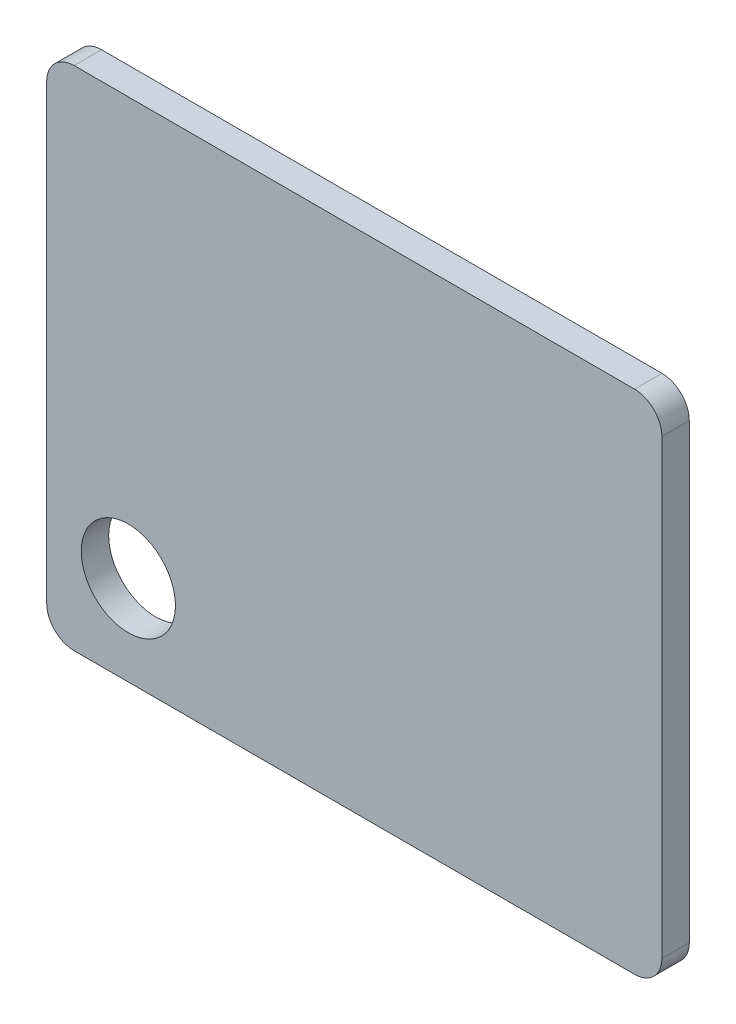
ISO-10303-21;
HEADER;
FILE_DESCRIPTION(('STEP AP214'),'2;1');
FILE_NAME('part.step','',(''),(''),'','','');
FILE_SCHEMA(('AUTOMOTIVE_DESIGN { 1 0 10303 214 1 1 1 1 }'));
ENDSEC;
DATA;
#1=APPLICATION_CONTEXT('core data for automotive mechanical design processes');
#2=APPLICATION_PROTOCOL_DEFINITION('international standard','automotive_design',2000,#1);
#3=PRODUCT_CONTEXT('',#1,'mechanical');
#4=PRODUCT('Part','Part','',(#3));
#5=PRODUCT_RELATED_PRODUCT_CATEGORY('part','',(#4));
#6=PRODUCT_DEFINITION_FORMATION('','',#4);
#7=PRODUCT_DEFINITION_CONTEXT('part definition',#1,'design');
#8=PRODUCT_DEFINITION('design','',#6,#7);
#9=PRODUCT_DEFINITION_SHAPE('','',#8);
#10=(LENGTH_UNIT() NAMED_UNIT(*) SI_UNIT(.MILLI.,.METRE.));
#11=(NAMED_UNIT(*) PLANE_ANGLE_UNIT() SI_UNIT($,.RADIAN.));
#12=(NAMED_UNIT(*) SI_UNIT($,.STERADIAN.) SOLID_ANGLE_UNIT());
#13=UNCERTAINTY_MEASURE_WITH_UNIT(LENGTH_MEASURE(1.E-05),#10,'distance_accuracy_value','');
#14=(GEOMETRIC_REPRESENTATION_CONTEXT(3) GLOBAL_UNCERTAINTY_ASSIGNED_CONTEXT((#13)) GLOBAL_UNIT_ASSIGNED_CONTEXT((#10,
#11,#12)) REPRESENTATION_CONTEXT('',''));
#15=CARTESIAN_POINT('',(0.,0.,0.));
#16=DIRECTION('',(0.,0.,1.));
#17=DIRECTION('',(1.,0.,0.));
#18=AXIS2_PLACEMENT_3D('',#15,#16,#17);
#19=CARTESIAN_POINT('',(-0.656919797954,-0.592175564513,0.79));
#20=DIRECTION('',(0.,0.,1.));
#21=DIRECTION('',(1.,0.,0.));
#22=AXIS2_PLACEMENT_3D('',#19,#20,#21);
#23=PLANE('',#22);
#24=CARTESIAN_POINT('',(-0.828774343426,-0.592175564513,0.79));
#25=DIRECTION('',(0.,0.,-1.));
#26=DIRECTION('',(-1.,0.,0.));
#27=AXIS2_PLACEMENT_3D('',#24,#25,#26);
#28=CIRCLE('',#27,0.171854545472);
#29=CARTESIAN_POINT('',(-1.000628888898,-0.592175564513,0.79));
#30=VERTEX_POINT('',#29);
#31=EDGE_CURVE('E128',#30,#30,#28,.T.);
#32=ORIENTED_EDGE('',*,*,#31,.T.);
#33=EDGE_LOOP('',(#32));
#34=FACE_BOUND('',#33,.T.);
#35=DIRECTION('',(0.,1.,0.));
#36=VECTOR('',#35,1.);
#37=CARTESIAN_POINT('',(1.118498384139,0.004988071731455,0.79));
#38=LINE('',#37,#36);
#39=CARTESIAN_POINT('',(1.118498384139,0.829788071824,0.79));
#40=VERTEX_POINT('',#39);
#41=CARTESIAN_POINT('',(1.118498384139,-0.819811928361,0.79));
#42=VERTEX_POINT('',#41);
#43=EDGE_CURVE('E92',#40,#42,#38,.F.);
#44=ORIENTED_EDGE('',*,*,#43,.F.);
#45=CARTESIAN_POINT('',(1.018498384139,0.829788071824,0.79));
#46=DIRECTION('',(0.,0.,-1.));
#47=DIRECTION('',(-1.,0.,0.));
#48=AXIS2_PLACEMENT_3D('',#45,#46,#47);
#49=CIRCLE('',#48,0.1);
#50=CARTESIAN_POINT('',(1.018498384139,0.929788071824,0.79));
#51=VERTEX_POINT('',#50);
#52=EDGE_CURVE('E20',#51,#40,#49,.T.);
#53=ORIENTED_EDGE('',*,*,#52,.F.);
#54=DIRECTION('',(-1.,0.,0.));
#55=VECTOR('',#54,1.);
#56=CARTESIAN_POINT('',(-0.004119797791775,0.929788071824,0.79));
#57=LINE('',#56,#55);
#58=CARTESIAN_POINT('',(-1.026737979722,0.929788071824,0.79));
#59=VERTEX_POINT('',#58);
#60=EDGE_CURVE('E79',#59,#51,#57,.F.);
#61=ORIENTED_EDGE('',*,*,#60,.F.);
#62=CARTESIAN_POINT('',(-1.026737979722,0.829788071824,0.79));
#63=DIRECTION('',(0.,0.,-1.));
#64=DIRECTION('',(-1.,0.,0.));
#65=AXIS2_PLACEMENT_3D('',#62,#63,#64);
#66=CIRCLE('',#65,0.1);
#67=CARTESIAN_POINT('',(-1.126737979722,0.829788071824,0.79));
#68=VERTEX_POINT('',#67);
#69=EDGE_CURVE('E134',#68,#59,#66,.T.);
#70=ORIENTED_EDGE('',*,*,#69,.F.);
#71=DIRECTION('',(0.,1.,0.));
#72=VECTOR('',#71,1.);
#73=CARTESIAN_POINT('',(-1.126737979722,0.004988071731455,0.79));
#74=LINE('',#73,#72);
#75=CARTESIAN_POINT('',(-1.126737979722,-0.819811928361,0.79));
#76=VERTEX_POINT('',#75);
#77=EDGE_CURVE('E112',#76,#68,#74,.T.);
#78=ORIENTED_EDGE('',*,*,#77,.F.);
#79=CARTESIAN_POINT('',(-1.026737979722,-0.819811928361,0.79));
#80=DIRECTION('',(0.,0.,-1.));
#81=DIRECTION('',(-1.,0.,0.));
#82=AXIS2_PLACEMENT_3D('',#79,#80,#81);
#83=CIRCLE('',#82,0.1);
#84=CARTESIAN_POINT('',(-1.026737979722,-0.919811928361,0.79));
#85=VERTEX_POINT('',#84);
#86=EDGE_CURVE('E133',#85,#76,#83,.T.);
#87=ORIENTED_EDGE('',*,*,#86,.F.);
#88=DIRECTION('',(1.,0.,0.));
#89=VECTOR('',#88,1.);
#90=CARTESIAN_POINT('',(-0.004119797791775,-0.919811928361,0.79));
#91=LINE('',#90,#89);
#92=CARTESIAN_POINT('',(1.018498384139,-0.919811928361,0.79));
#93=VERTEX_POINT('',#92);
#94=EDGE_CURVE('E108',#93,#85,#91,.F.);
#95=ORIENTED_EDGE('',*,*,#94,.F.);
#96=CARTESIAN_POINT('',(1.018498384139,-0.819811928361,0.79));
#97=DIRECTION('',(0.,0.,-1.));
#98=DIRECTION('',(-1.,0.,0.));
#99=AXIS2_PLACEMENT_3D('',#96,#97,#98);
#100=CIRCLE('',#99,0.1);
#101=EDGE_CURVE('E95',#42,#93,#100,.T.);
#102=ORIENTED_EDGE('',*,*,#101,.F.);
#103=EDGE_LOOP('',(#44,#53,#61,#70,#78,#87,#95,#102));
#104=FACE_BOUND('',#103,.T.);
#105=ADVANCED_FACE('F17',(#34,#104),#23,.T.);
#106=CARTESIAN_POINT('',(1.118498384139,0.004988071731455,0.69));
#107=DIRECTION('',(1.,0.,0.));
#108=DIRECTION('',(0.,0.,-1.));
#109=AXIS2_PLACEMENT_3D('',#106,#107,#108);
#110=PLANE('',#109);
#111=ORIENTED_EDGE('',*,*,#43,.T.);
#112=DIRECTION('',(0.,0.,-1.));
#113=VECTOR('',#112,1.);
#114=CARTESIAN_POINT('',(1.118498384139,-0.819811928361,0.69));
#115=LINE('',#114,#113);
#116=CARTESIAN_POINT('',(1.118498384139,-0.819811928361,0.69));
#117=VERTEX_POINT('',#116);
#118=EDGE_CURVE('E132',#117,#42,#115,.F.);
#119=ORIENTED_EDGE('',*,*,#118,.F.);
#120=DIRECTION('',(0.,1.,0.));
#121=VECTOR('',#120,1.);
#122=CARTESIAN_POINT('',(1.118498384139,0.004988071731455,0.69));
#123=LINE('',#122,#121);
#124=CARTESIAN_POINT('',(1.118498384139,0.829788071824,0.69));
#125=VERTEX_POINT('',#124);
#126=EDGE_CURVE('E102',#117,#125,#123,.T.);
#127=ORIENTED_EDGE('',*,*,#126,.T.);
#128=DIRECTION('',(0.,0.,-1.));
#129=VECTOR('',#128,1.);
#130=CARTESIAN_POINT('',(1.118498384139,0.829788071824,0.69));
#131=LINE('',#130,#129);
#132=EDGE_CURVE('E88',#40,#125,#131,.T.);
#133=ORIENTED_EDGE('',*,*,#132,.F.);
#134=EDGE_LOOP('',(#111,#119,#127,#133));
#135=FACE_BOUND('',#134,.T.);
#136=ADVANCED_FACE('F101',(#135),#110,.T.);
#137=CARTESIAN_POINT('',(1.018498384139,0.829788071824,0.69));
#138=DIRECTION('',(0.,0.,-1.));
#139=DIRECTION('',(-1.,0.,0.));
#140=AXIS2_PLACEMENT_3D('',#137,#138,#139);
#141=CYLINDRICAL_SURFACE('',#140,0.1);
#142=ORIENTED_EDGE('',*,*,#132,.T.);
#143=CARTESIAN_POINT('',(1.018498384139,0.829788071824,0.69));
#144=DIRECTION('',(0.,0.,-1.));
#145=DIRECTION('',(-1.,0.,0.));
#146=AXIS2_PLACEMENT_3D('',#143,#144,#145);
#147=CIRCLE('',#146,0.1);
#148=CARTESIAN_POINT('',(1.018498384139,0.929788071824,0.69));
#149=VERTEX_POINT('',#148);
#150=EDGE_CURVE('E126',#125,#149,#147,.F.);
#151=ORIENTED_EDGE('',*,*,#150,.T.);
#152=DIRECTION('',(0.,0.,1.));
#153=VECTOR('',#152,1.);
#154=CARTESIAN_POINT('',(1.018498384139,0.929788071824,0.69));
#155=LINE('',#154,#153);
#156=EDGE_CURVE('E90',#51,#149,#155,.F.);
#157=ORIENTED_EDGE('',*,*,#156,.F.);
#158=ORIENTED_EDGE('',*,*,#52,.T.);
#159=EDGE_LOOP('',(#142,#151,#157,#158));
#160=FACE_BOUND('',#159,.T.);
#161=ADVANCED_FACE('F85',(#160),#141,.T.);
#162=CARTESIAN_POINT('',(-0.004119797791775,0.929788071824,0.69));
#163=DIRECTION('',(0.,1.,0.));
#164=DIRECTION('',(-1.,0.,0.));
#165=AXIS2_PLACEMENT_3D('',#162,#163,#164);
#166=PLANE('',#165);
#167=ORIENTED_EDGE('',*,*,#60,.T.);
#168=ORIENTED_EDGE('',*,*,#156,.T.);
#169=DIRECTION('',(1.,0.,0.));
#170=VECTOR('',#169,1.);
#171=CARTESIAN_POINT('',(-0.004119797791775,0.929788071824,0.69));
#172=LINE('',#171,#170);
#173=CARTESIAN_POINT('',(-1.026737979722,0.929788071824,0.69));
#174=VERTEX_POINT('',#173);
#175=EDGE_CURVE('E125',#149,#174,#172,.F.);
#176=ORIENTED_EDGE('',*,*,#175,.T.);
#177=DIRECTION('',(0.,0.,-1.));
#178=VECTOR('',#177,1.);
#179=CARTESIAN_POINT('',(-1.026737979722,0.929788071824,0.69));
#180=LINE('',#179,#178);
#181=EDGE_CURVE('E114',#59,#174,#180,.T.);
#182=ORIENTED_EDGE('',*,*,#181,.F.);
#183=EDGE_LOOP('',(#167,#168,#176,#182));
#184=FACE_BOUND('',#183,.T.);
#185=ADVANCED_FACE('F140',(#184),#166,.T.);
#186=CARTESIAN_POINT('',(-1.026737979722,0.829788071824,0.69));
#187=DIRECTION('',(0.,0.,-1.));
#188=DIRECTION('',(-1.,0.,0.));
#189=AXIS2_PLACEMENT_3D('',#186,#187,#188);
#190=CYLINDRICAL_SURFACE('',#189,0.1);
#191=ORIENTED_EDGE('',*,*,#181,.T.);
#192=CARTESIAN_POINT('',(-1.026737979722,0.829788071824,0.69));
#193=DIRECTION('',(0.,0.,-1.));
#194=DIRECTION('',(-1.,0.,0.));
#195=AXIS2_PLACEMENT_3D('',#192,#193,#194);
#196=CIRCLE('',#195,0.1);
#197=CARTESIAN_POINT('',(-1.126737979722,0.829788071824,0.69));
#198=VERTEX_POINT('',#197);
#199=EDGE_CURVE('E122',#174,#198,#196,.F.);
#200=ORIENTED_EDGE('',*,*,#199,.T.);
#201=DIRECTION('',(0.,0.,1.));
#202=VECTOR('',#201,1.);
#203=CARTESIAN_POINT('',(-1.126737979722,0.829788071824,0.69));
#204=LINE('',#203,#202);
#205=EDGE_CURVE('E113',#68,#198,#204,.F.);
#206=ORIENTED_EDGE('',*,*,#205,.F.);
#207=ORIENTED_EDGE('',*,*,#69,.T.);
#208=EDGE_LOOP('',(#191,#200,#206,#207));
#209=FACE_BOUND('',#208,.T.);
#210=ADVANCED_FACE('F161',(#209),#190,.T.);
#211=CARTESIAN_POINT('',(-1.126737979722,0.004988071731455,0.69));
#212=DIRECTION('',(-1.,0.,0.));
#213=DIRECTION('',(0.,0.,1.));
#214=AXIS2_PLACEMENT_3D('',#211,#212,#213);
#215=PLANE('',#214);
#216=ORIENTED_EDGE('',*,*,#77,.T.);
#217=ORIENTED_EDGE('',*,*,#205,.T.);
#218=DIRECTION('',(0.,1.,0.));
#219=VECTOR('',#218,1.);
#220=CARTESIAN_POINT('',(-1.126737979722,0.004988071731455,0.69));
#221=LINE('',#220,#219);
#222=CARTESIAN_POINT('',(-1.126737979722,-0.819811928361,0.69));
#223=VERTEX_POINT('',#222);
#224=EDGE_CURVE('E121',#198,#223,#221,.F.);
#225=ORIENTED_EDGE('',*,*,#224,.T.);
#226=DIRECTION('',(0.,0.,-1.));
#227=VECTOR('',#226,1.);
#228=CARTESIAN_POINT('',(-1.126737979722,-0.819811928361,0.69));
#229=LINE('',#228,#227);
#230=EDGE_CURVE('E110',#76,#223,#229,.T.);
#231=ORIENTED_EDGE('',*,*,#230,.F.);
#232=EDGE_LOOP('',(#216,#217,#225,#231));
#233=FACE_BOUND('',#232,.T.);
#234=ADVANCED_FACE('F157',(#233),#215,.T.);
#235=CARTESIAN_POINT('',(-1.026737979722,-0.819811928361,0.69));
#236=DIRECTION('',(0.,0.,-1.));
#237=DIRECTION('',(-1.,0.,0.));
#238=AXIS2_PLACEMENT_3D('',#235,#236,#237);
#239=CYLINDRICAL_SURFACE('',#238,0.1);
#240=ORIENTED_EDGE('',*,*,#230,.T.);
#241=CARTESIAN_POINT('',(-1.026737979722,-0.819811928361,0.69));
#242=DIRECTION('',(0.,0.,-1.));
#243=DIRECTION('',(-1.,0.,0.));
#244=AXIS2_PLACEMENT_3D('',#241,#242,#243);
#245=CIRCLE('',#244,0.1);
#246=CARTESIAN_POINT('',(-1.026737979722,-0.919811928361,0.69));
#247=VERTEX_POINT('',#246);
#248=EDGE_CURVE('E118',#223,#247,#245,.F.);
#249=ORIENTED_EDGE('',*,*,#248,.T.);
#250=DIRECTION('',(0.,0.,-1.));
#251=VECTOR('',#250,1.);
#252=CARTESIAN_POINT('',(-1.026737979722,-0.919811928361,0.69));
#253=LINE('',#252,#251);
#254=EDGE_CURVE('E109',#85,#247,#253,.T.);
#255=ORIENTED_EDGE('',*,*,#254,.F.);
#256=ORIENTED_EDGE('',*,*,#86,.T.);
#257=EDGE_LOOP('',(#240,#249,#255,#256));
#258=FACE_BOUND('',#257,.T.);
#259=ADVANCED_FACE('F169',(#258),#239,.T.);
#260=CARTESIAN_POINT('',(-0.004119797791775,-0.919811928361,0.69));
#261=DIRECTION('',(0.,-1.,0.));
#262=DIRECTION('',(0.,0.,-1.));
#263=AXIS2_PLACEMENT_3D('',#260,#261,#262);
#264=PLANE('',#263);
#265=ORIENTED_EDGE('',*,*,#94,.T.);
#266=ORIENTED_EDGE('',*,*,#254,.T.);
#267=DIRECTION('',(1.,0.,0.));
#268=VECTOR('',#267,1.);
#269=CARTESIAN_POINT('',(-0.004119797791775,-0.919811928361,0.69));
#270=LINE('',#269,#268);
#271=CARTESIAN_POINT('',(1.018498384139,-0.919811928361,0.69));
#272=VERTEX_POINT('',#271);
#273=EDGE_CURVE('E117',#247,#272,#270,.T.);
#274=ORIENTED_EDGE('',*,*,#273,.T.);
#275=DIRECTION('',(0.,0.,-1.));
#276=VECTOR('',#275,1.);
#277=CARTESIAN_POINT('',(1.018498384139,-0.919811928361,0.69));
#278=LINE('',#277,#276);
#279=EDGE_CURVE('E35',#93,#272,#278,.T.);
#280=ORIENTED_EDGE('',*,*,#279,.F.);
#281=EDGE_LOOP('',(#265,#266,#274,#280));
#282=FACE_BOUND('',#281,.T.);
#283=ADVANCED_FACE('F186',(#282),#264,.T.);
#284=CARTESIAN_POINT('',(1.018498384139,-0.819811928361,0.69));
#285=DIRECTION('',(0.,0.,-1.));
#286=DIRECTION('',(-1.,0.,0.));
#287=AXIS2_PLACEMENT_3D('',#284,#285,#286);
#288=CYLINDRICAL_SURFACE('',#287,0.1);
#289=ORIENTED_EDGE('',*,*,#279,.T.);
#290=CARTESIAN_POINT('',(1.018498384139,-0.819811928361,0.69));
#291=DIRECTION('',(0.,0.,-1.));
#292=DIRECTION('',(-1.,0.,0.));
#293=AXIS2_PLACEMENT_3D('',#290,#291,#292);
#294=CIRCLE('',#293,0.1);
#295=EDGE_CURVE('E26',#272,#117,#294,.F.);
#296=ORIENTED_EDGE('',*,*,#295,.T.);
#297=ORIENTED_EDGE('',*,*,#118,.T.);
#298=ORIENTED_EDGE('',*,*,#101,.T.);
#299=EDGE_LOOP('',(#289,#296,#297,#298));
#300=FACE_BOUND('',#299,.T.);
#301=ADVANCED_FACE('F179',(#300),#288,.T.);
#302=CARTESIAN_POINT('',(-0.828774343426,-0.592175564513,0.69));
#303=DIRECTION('',(0.,0.,-1.));
#304=DIRECTION('',(-1.,0.,0.));
#305=AXIS2_PLACEMENT_3D('',#302,#303,#304);
#306=CYLINDRICAL_SURFACE('',#305,0.171854545472);
#307=ORIENTED_EDGE('',*,*,#31,.F.);
#308=EDGE_LOOP('',(#307));
#309=FACE_BOUND('',#308,.T.);
#310=CARTESIAN_POINT('',(-0.828774343426,-0.592175564513,0.69));
#311=DIRECTION('',(0.,0.,-1.));
#312=DIRECTION('',(-1.,0.,0.));
#313=AXIS2_PLACEMENT_3D('',#310,#311,#312);
#314=CIRCLE('',#313,0.171854545472);
#315=CARTESIAN_POINT('',(-1.000628888898,-0.592175564513,0.69));
#316=VERTEX_POINT('',#315);
#317=EDGE_CURVE('E11',#316,#316,#314,.T.);
#318=ORIENTED_EDGE('',*,*,#317,.T.);
#319=EDGE_LOOP('',(#318));
#320=FACE_BOUND('',#319,.T.);
#321=ADVANCED_FACE('F173',(#309,#320),#306,.F.);
#322=CARTESIAN_POINT('',(-0.004119797791775,0.004988071731455,0.69));
#323=DIRECTION('',(0.,0.,1.));
#324=DIRECTION('',(1.,0.,0.));
#325=AXIS2_PLACEMENT_3D('',#322,#323,#324);
#326=PLANE('',#325);
#327=ORIENTED_EDGE('',*,*,#317,.F.);
#328=EDGE_LOOP('',(#327));
#329=FACE_BOUND('',#328,.T.);
#330=ORIENTED_EDGE('',*,*,#273,.F.);
#331=ORIENTED_EDGE('',*,*,#248,.F.);
#332=ORIENTED_EDGE('',*,*,#224,.F.);
#333=ORIENTED_EDGE('',*,*,#199,.F.);
#334=ORIENTED_EDGE('',*,*,#175,.F.);
#335=ORIENTED_EDGE('',*,*,#150,.F.);
#336=ORIENTED_EDGE('',*,*,#126,.F.);
#337=ORIENTED_EDGE('',*,*,#295,.F.);
#338=EDGE_LOOP('',(#330,#331,#332,#333,#334,#335,#336,#337));
#339=FACE_BOUND('',#338,.T.);
#340=ADVANCED_FACE('F144',(#329,#339),#326,.F.);
#341=CLOSED_SHELL('',(#105,#136,#161,#185,#210,#234,#259,#283,#301,#321,#340));
#342=MANIFOLD_SOLID_BREP('B1',#341);
#343=ADVANCED_BREP_SHAPE_REPRESENTATION('',(#18,#342),#14);
#344=SHAPE_DEFINITION_REPRESENTATION(#9,#343);
ENDSEC;
END-ISO-10303-21;
